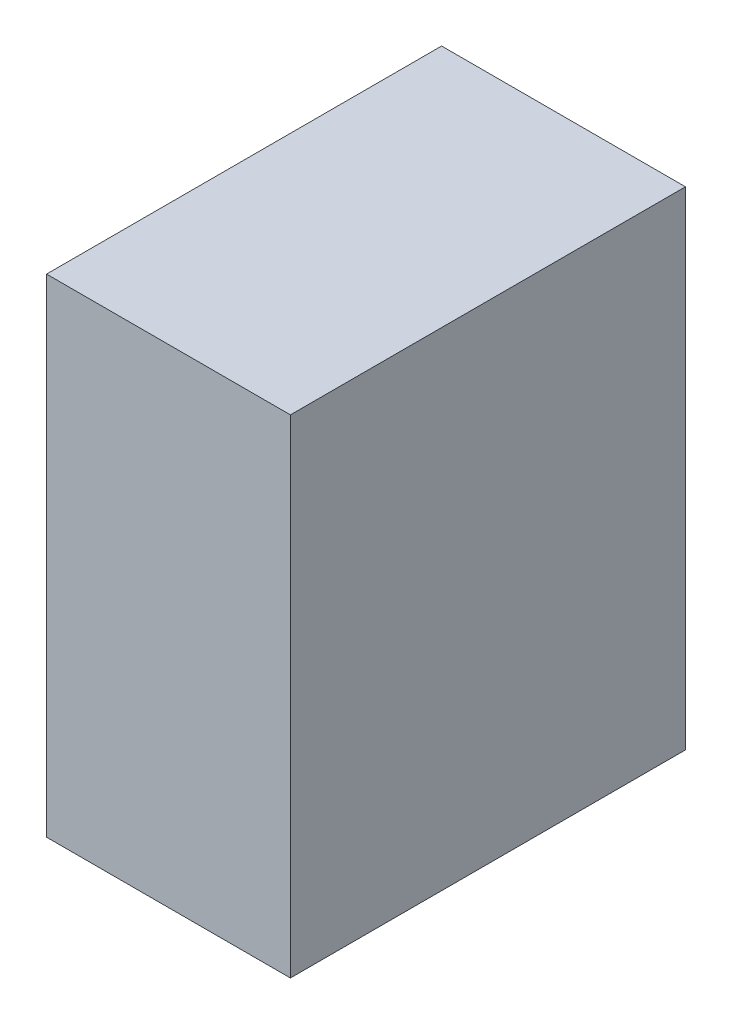
ISO-10303-21;
HEADER;
FILE_DESCRIPTION(('STEP AP214'),'2;1');
FILE_NAME('part.step','',(''),(''),'','','');
FILE_SCHEMA(('AUTOMOTIVE_DESIGN { 1 0 10303 214 1 1 1 1 }'));
ENDSEC;
DATA;
#1=APPLICATION_CONTEXT('core data for automotive mechanical design processes');
#2=APPLICATION_PROTOCOL_DEFINITION('international standard','automotive_design',2000,#1);
#3=PRODUCT_CONTEXT('',#1,'mechanical');
#4=PRODUCT('Part','Part','',(#3));
#5=PRODUCT_RELATED_PRODUCT_CATEGORY('part','',(#4));
#6=PRODUCT_DEFINITION_FORMATION('','',#4);
#7=PRODUCT_DEFINITION_CONTEXT('part definition',#1,'design');
#8=PRODUCT_DEFINITION('design','',#6,#7);
#9=PRODUCT_DEFINITION_SHAPE('','',#8);
#10=(LENGTH_UNIT() NAMED_UNIT(*) SI_UNIT(.MILLI.,.METRE.));
#11=(NAMED_UNIT(*) PLANE_ANGLE_UNIT() SI_UNIT($,.RADIAN.));
#12=(NAMED_UNIT(*) SI_UNIT($,.STERADIAN.) SOLID_ANGLE_UNIT());
#13=UNCERTAINTY_MEASURE_WITH_UNIT(LENGTH_MEASURE(1.E-05),#10,'distance_accuracy_value','');
#14=(GEOMETRIC_REPRESENTATION_CONTEXT(3) GLOBAL_UNCERTAINTY_ASSIGNED_CONTEXT((#13)) GLOBAL_UNIT_ASSIGNED_CONTEXT((#10,
#11,#12)) REPRESENTATION_CONTEXT('',''));
#15=CARTESIAN_POINT('',(0.,0.,0.));
#16=DIRECTION('',(0.,0.,1.));
#17=DIRECTION('',(1.,0.,0.));
#18=AXIS2_PLACEMENT_3D('',#15,#16,#17);
#19=CARTESIAN_POINT('',(10.,0.,0.));
#20=DIRECTION('',(0.,0.,-1.));
#21=DIRECTION('',(-1.,0.,0.));
#22=AXIS2_PLACEMENT_3D('',#19,#20,#21);
#23=PLANE('',#22);
#24=DIRECTION('',(0.,-1.,0.));
#25=VECTOR('',#24,1.);
#26=CARTESIAN_POINT('',(0.,0.,0.));
#27=LINE('',#26,#25);
#28=CARTESIAN_POINT('',(0.,20.,0.));
#29=VERTEX_POINT('',#28);
#30=CARTESIAN_POINT('',(0.,0.,0.));
#31=VERTEX_POINT('',#30);
#32=EDGE_CURVE('E106',#29,#31,#27,.T.);
#33=ORIENTED_EDGE('',*,*,#32,.T.);
#34=DIRECTION('',(-1.,0.,0.));
#35=VECTOR('',#34,1.);
#36=CARTESIAN_POINT('',(10.,0.,0.));
#37=LINE('',#36,#35);
#38=CARTESIAN_POINT('',(10.,0.,0.));
#39=VERTEX_POINT('',#38);
#40=EDGE_CURVE('E11',#39,#31,#37,.T.);
#41=ORIENTED_EDGE('',*,*,#40,.F.);
#42=DIRECTION('',(0.,-1.,0.));
#43=VECTOR('',#42,1.);
#44=CARTESIAN_POINT('',(10.,0.,0.));
#45=LINE('',#44,#43);
#46=CARTESIAN_POINT('',(10.,20.,0.));
#47=VERTEX_POINT('',#46);
#48=EDGE_CURVE('E92',#47,#39,#45,.T.);
#49=ORIENTED_EDGE('',*,*,#48,.F.);
#50=DIRECTION('',(-1.,0.,0.));
#51=VECTOR('',#50,1.);
#52=CARTESIAN_POINT('',(10.,20.,0.));
#53=LINE('',#52,#51);
#54=EDGE_CURVE('E105',#47,#29,#53,.T.);
#55=ORIENTED_EDGE('',*,*,#54,.T.);
#56=EDGE_LOOP('',(#33,#41,#49,#55));
#57=FACE_BOUND('',#56,.T.);
#58=ADVANCED_FACE('F43',(#57),#23,.F.);
#59=CARTESIAN_POINT('',(10.,0.,0.));
#60=DIRECTION('',(0.,1.,0.));
#61=DIRECTION('',(0.,0.,1.));
#62=AXIS2_PLACEMENT_3D('',#59,#60,#61);
#63=PLANE('',#62);
#64=DIRECTION('',(0.,0.,-1.));
#65=VECTOR('',#64,1.);
#66=CARTESIAN_POINT('',(0.,0.,0.));
#67=LINE('',#66,#65);
#68=CARTESIAN_POINT('',(0.,0.,-16.2));
#69=VERTEX_POINT('',#68);
#70=EDGE_CURVE('E97',#31,#69,#67,.T.);
#71=ORIENTED_EDGE('',*,*,#70,.T.);
#72=DIRECTION('',(-1.,0.,0.));
#73=VECTOR('',#72,1.);
#74=CARTESIAN_POINT('',(10.,0.,-16.2));
#75=LINE('',#74,#73);
#76=CARTESIAN_POINT('',(10.,0.,-16.2));
#77=VERTEX_POINT('',#76);
#78=EDGE_CURVE('E51',#77,#69,#75,.T.);
#79=ORIENTED_EDGE('',*,*,#78,.F.);
#80=DIRECTION('',(0.,0.,-1.));
#81=VECTOR('',#80,1.);
#82=CARTESIAN_POINT('',(10.,0.,0.));
#83=LINE('',#82,#81);
#84=EDGE_CURVE('E87',#39,#77,#83,.T.);
#85=ORIENTED_EDGE('',*,*,#84,.F.);
#86=ORIENTED_EDGE('',*,*,#40,.T.);
#87=EDGE_LOOP('',(#71,#79,#85,#86));
#88=FACE_BOUND('',#87,.T.);
#89=ADVANCED_FACE('F100',(#88),#63,.F.);
#90=CARTESIAN_POINT('',(10.,0.,-16.2));
#91=DIRECTION('',(0.,0.,1.));
#92=DIRECTION('',(1.,0.,0.));
#93=AXIS2_PLACEMENT_3D('',#90,#91,#92);
#94=PLANE('',#93);
#95=DIRECTION('',(0.,1.,0.));
#96=VECTOR('',#95,1.);
#97=CARTESIAN_POINT('',(0.,0.,-16.2));
#98=LINE('',#97,#96);
#99=CARTESIAN_POINT('',(0.,20.,-16.2));
#100=VERTEX_POINT('',#99);
#101=EDGE_CURVE('E78',#69,#100,#98,.T.);
#102=ORIENTED_EDGE('',*,*,#101,.T.);
#103=DIRECTION('',(-1.,0.,0.));
#104=VECTOR('',#103,1.);
#105=CARTESIAN_POINT('',(10.,20.,-16.2));
#106=LINE('',#105,#104);
#107=CARTESIAN_POINT('',(10.,20.,-16.2));
#108=VERTEX_POINT('',#107);
#109=EDGE_CURVE('E98',#108,#100,#106,.T.);
#110=ORIENTED_EDGE('',*,*,#109,.F.);
#111=DIRECTION('',(0.,1.,0.));
#112=VECTOR('',#111,1.);
#113=CARTESIAN_POINT('',(10.,0.,-16.2));
#114=LINE('',#113,#112);
#115=EDGE_CURVE('E95',#77,#108,#114,.T.);
#116=ORIENTED_EDGE('',*,*,#115,.F.);
#117=ORIENTED_EDGE('',*,*,#78,.T.);
#118=EDGE_LOOP('',(#102,#110,#116,#117));
#119=FACE_BOUND('',#118,.T.);
#120=ADVANCED_FACE('F99',(#119),#94,.F.);
#121=CARTESIAN_POINT('',(10.,20.,0.));
#122=DIRECTION('',(0.,-1.,0.));
#123=DIRECTION('',(0.,0.,-1.));
#124=AXIS2_PLACEMENT_3D('',#121,#122,#123);
#125=PLANE('',#124);
#126=DIRECTION('',(0.,0.,1.));
#127=VECTOR('',#126,1.);
#128=CARTESIAN_POINT('',(0.,20.,0.));
#129=LINE('',#128,#127);
#130=EDGE_CURVE('E85',#100,#29,#129,.T.);
#131=ORIENTED_EDGE('',*,*,#130,.T.);
#132=ORIENTED_EDGE('',*,*,#54,.F.);
#133=DIRECTION('',(0.,0.,1.));
#134=VECTOR('',#133,1.);
#135=CARTESIAN_POINT('',(10.,20.,0.));
#136=LINE('',#135,#134);
#137=EDGE_CURVE('E56',#108,#47,#136,.T.);
#138=ORIENTED_EDGE('',*,*,#137,.F.);
#139=ORIENTED_EDGE('',*,*,#109,.T.);
#140=EDGE_LOOP('',(#131,#132,#138,#139));
#141=FACE_BOUND('',#140,.T.);
#142=ADVANCED_FACE('F111',(#141),#125,.F.);
#143=CARTESIAN_POINT('',(10.,0.,0.));
#144=DIRECTION('',(-1.,0.,0.));
#145=DIRECTION('',(0.,0.,1.));
#146=AXIS2_PLACEMENT_3D('',#143,#144,#145);
#147=PLANE('',#146);
#148=ORIENTED_EDGE('',*,*,#48,.T.);
#149=ORIENTED_EDGE('',*,*,#84,.T.);
#150=ORIENTED_EDGE('',*,*,#115,.T.);
#151=ORIENTED_EDGE('',*,*,#137,.T.);
#152=EDGE_LOOP('',(#148,#149,#150,#151));
#153=FACE_BOUND('',#152,.T.);
#154=ADVANCED_FACE('F89',(#153),#147,.F.);
#155=CARTESIAN_POINT('',(0.,0.,0.));
#156=DIRECTION('',(-1.,0.,0.));
#157=DIRECTION('',(0.,0.,1.));
#158=AXIS2_PLACEMENT_3D('',#155,#156,#157);
#159=PLANE('',#158);
#160=ORIENTED_EDGE('',*,*,#32,.F.);
#161=ORIENTED_EDGE('',*,*,#130,.F.);
#162=ORIENTED_EDGE('',*,*,#101,.F.);
#163=ORIENTED_EDGE('',*,*,#70,.F.);
#164=EDGE_LOOP('',(#160,#161,#162,#163));
#165=FACE_BOUND('',#164,.T.);
#166=ADVANCED_FACE('F116',(#165),#159,.T.);
#167=CLOSED_SHELL('',(#58,#89,#120,#142,#154,#166));
#168=MANIFOLD_SOLID_BREP('B2',#167);
#169=ADVANCED_BREP_SHAPE_REPRESENTATION('',(#18,#168),#14);
#170=SHAPE_DEFINITION_REPRESENTATION(#9,#169);
ENDSEC;
END-ISO-10303-21;
